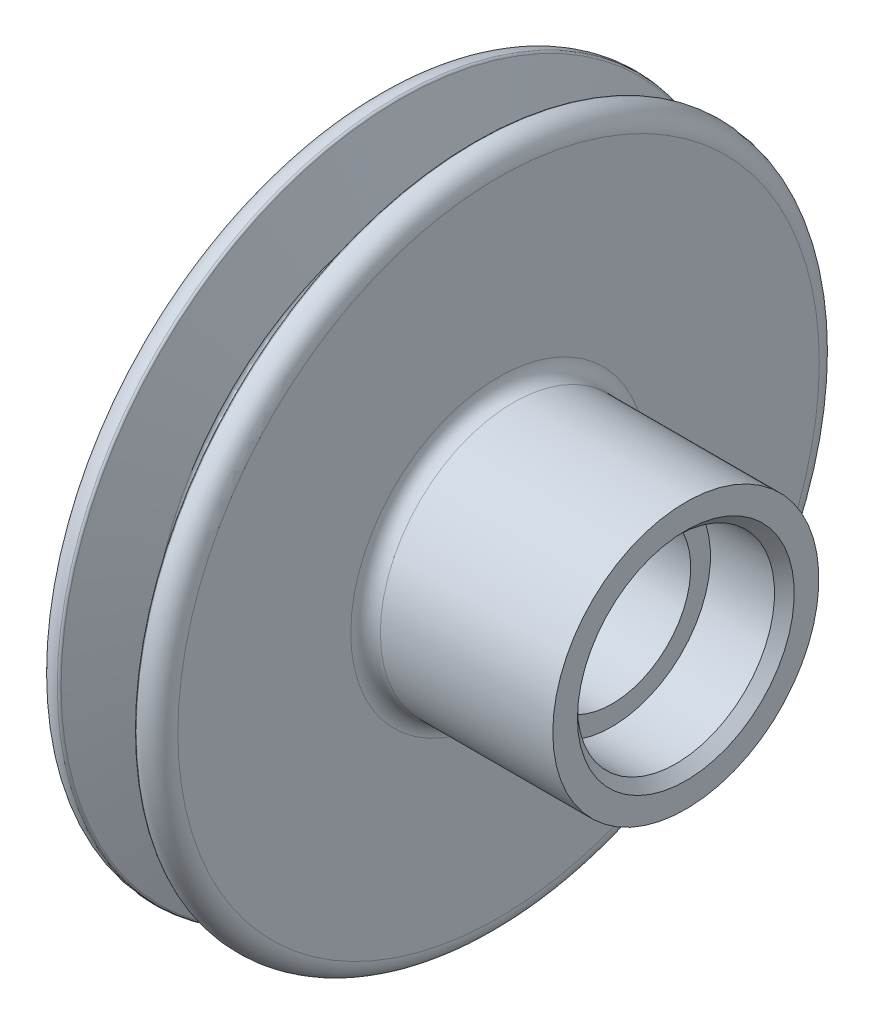
ISO-10303-21;
HEADER;
FILE_DESCRIPTION(('STEP AP214'),'2;1');
FILE_NAME('part.step','',(''),(''),'','','');
FILE_SCHEMA(('AUTOMOTIVE_DESIGN { 1 0 10303 214 1 1 1 1 }'));
ENDSEC;
DATA;
#1=APPLICATION_CONTEXT('core data for automotive mechanical design processes');
#2=APPLICATION_PROTOCOL_DEFINITION('international standard','automotive_design',2000,#1);
#3=PRODUCT_CONTEXT('',#1,'mechanical');
#4=PRODUCT('Part','Part','',(#3));
#5=PRODUCT_RELATED_PRODUCT_CATEGORY('part','',(#4));
#6=PRODUCT_DEFINITION_FORMATION('','',#4);
#7=PRODUCT_DEFINITION_CONTEXT('part definition',#1,'design');
#8=PRODUCT_DEFINITION('design','',#6,#7);
#9=PRODUCT_DEFINITION_SHAPE('','',#8);
#10=(LENGTH_UNIT() NAMED_UNIT(*) SI_UNIT(.MILLI.,.METRE.));
#11=(NAMED_UNIT(*) PLANE_ANGLE_UNIT() SI_UNIT($,.RADIAN.));
#12=(NAMED_UNIT(*) SI_UNIT($,.STERADIAN.) SOLID_ANGLE_UNIT());
#13=UNCERTAINTY_MEASURE_WITH_UNIT(LENGTH_MEASURE(1.E-05),#10,'distance_accuracy_value','');
#14=(GEOMETRIC_REPRESENTATION_CONTEXT(3) GLOBAL_UNCERTAINTY_ASSIGNED_CONTEXT((#13)) GLOBAL_UNIT_ASSIGNED_CONTEXT((#10,
#11,#12)) REPRESENTATION_CONTEXT('',''));
#15=CARTESIAN_POINT('',(0.,0.,0.));
#16=DIRECTION('',(0.,0.,1.));
#17=DIRECTION('',(1.,0.,0.));
#18=AXIS2_PLACEMENT_3D('',#15,#16,#17);
#19=CARTESIAN_POINT('',(4.,0.,0.));
#20=DIRECTION('',(-1.,0.,0.));
#21=DIRECTION('',(0.,0.,1.));
#22=AXIS2_PLACEMENT_3D('',#19,#20,#21);
#23=TOROIDAL_SURFACE('',#22,65.0846343159085,4.);
#24=CARTESIAN_POINT('',(4.49229780879908,0.,0.));
#25=DIRECTION('',(-1.,0.,0.));
#26=DIRECTION('',(0.,0.,1.));
#27=AXIS2_PLACEMENT_3D('',#24,#25,#26);
#28=CIRCLE('',#27,69.0542240765078);
#29=CARTESIAN_POINT('',(4.49229780879908,0.,69.0542240765078));
#30=VERTEX_POINT('',#29);
#31=EDGE_CURVE('E79',#30,#30,#28,.T.);
#32=ORIENTED_EDGE('',*,*,#31,.T.);
#33=EDGE_LOOP('',(#32));
#34=FACE_BOUND('',#33,.T.);
#35=CARTESIAN_POINT('',(0.,0.,0.));
#36=DIRECTION('',(-1.,0.,0.));
#37=DIRECTION('',(0.,0.,1.));
#38=AXIS2_PLACEMENT_3D('',#35,#36,#37);
#39=CIRCLE('',#38,65.0846343159085);
#40=CARTESIAN_POINT('',(0.,0.,65.0846343159085));
#41=VERTEX_POINT('',#40);
#42=EDGE_CURVE('E118',#41,#41,#39,.T.);
#43=ORIENTED_EDGE('',*,*,#42,.F.);
#44=EDGE_LOOP('',(#43));
#45=FACE_BOUND('',#44,.T.);
#46=ADVANCED_FACE('F37',(#34,#45),#23,.T.);
#47=CARTESIAN_POINT('',(9.40444147385724,0.,0.));
#48=DIRECTION('',(-1.,0.,0.));
#49=DIRECTION('',(0.,0.,1.));
#50=AXIS2_PLACEMENT_3D('',#47,#48,#49);
#51=CONICAL_SURFACE('',#50,54.,1.27409035395586);
#52=CARTESIAN_POINT('',(9.18809779292271,0.,0.));
#53=DIRECTION('',(-1.,0.,0.));
#54=DIRECTION('',(0.,0.,1.));
#55=AXIS2_PLACEMENT_3D('',#52,#53,#54);
#56=CIRCLE('',#55,54.7076282952773);
#57=CARTESIAN_POINT('',(9.18809779292271,0.,54.7076282952773));
#58=VERTEX_POINT('',#57);
#59=EDGE_CURVE('E64',#58,#58,#56,.T.);
#60=ORIENTED_EDGE('',*,*,#59,.T.);
#61=EDGE_LOOP('',(#60));
#62=FACE_BOUND('',#61,.T.);
#63=CARTESIAN_POINT('',(4.90891296068067,0.,0.));
#64=DIRECTION('',(1.,0.,0.));
#65=DIRECTION('',(0.,0.,-1.));
#66=AXIS2_PLACEMENT_3D('',#63,#64,#65);
#67=CIRCLE('',#66,68.7042112087939);
#68=CARTESIAN_POINT('',(4.90891296068067,0.,-68.7042112087939));
#69=VERTEX_POINT('',#68);
#70=EDGE_CURVE('E76',#69,#69,#67,.T.);
#71=ORIENTED_EDGE('',*,*,#70,.T.);
#72=EDGE_LOOP('',(#71));
#73=FACE_BOUND('',#72,.T.);
#74=ADVANCED_FACE('F125',(#62,#73),#51,.T.);
#75=CARTESIAN_POINT('',(-22.8662381660023,0.,0.));
#76=DIRECTION('',(-1.,0.,0.));
#77=DIRECTION('',(0.,0.,1.));
#78=AXIS2_PLACEMENT_3D('',#75,#76,#77);
#79=CYLINDRICAL_SURFACE('',#78,54.);
#80=CARTESIAN_POINT('',(14.8555974511143,0.,0.));
#81=DIRECTION('',(-1.,0.,0.));
#82=DIRECTION('',(0.,0.,1.));
#83=AXIS2_PLACEMENT_3D('',#80,#81,#82);
#84=CIRCLE('',#83,54.);
#85=CARTESIAN_POINT('',(14.8555974511143,0.,54.));
#86=VERTEX_POINT('',#85);
#87=EDGE_CURVE('E70',#86,#86,#84,.T.);
#88=ORIENTED_EDGE('',*,*,#87,.T.);
#89=EDGE_LOOP('',(#88));
#90=FACE_BOUND('',#89,.T.);
#91=CARTESIAN_POINT('',(10.1444025488857,0.,0.));
#92=DIRECTION('',(-1.,0.,0.));
#93=DIRECTION('',(0.,0.,1.));
#94=AXIS2_PLACEMENT_3D('',#91,#92,#93);
#95=CIRCLE('',#94,54.);
#96=CARTESIAN_POINT('',(10.1444025488857,0.,54.));
#97=VERTEX_POINT('',#96);
#98=EDGE_CURVE('E73',#97,#97,#95,.F.);
#99=ORIENTED_EDGE('',*,*,#98,.T.);
#100=EDGE_LOOP('',(#99));
#101=FACE_BOUND('',#100,.T.);
#102=ADVANCED_FACE('F131',(#90,#101),#79,.T.);
#103=CARTESIAN_POINT('',(20.1815187480226,0.,0.));
#104=DIRECTION('',(1.,0.,0.));
#105=DIRECTION('',(0.,0.,-1.));
#106=AXIS2_PLACEMENT_3D('',#103,#104,#105);
#107=CONICAL_SURFACE('',#106,69.,1.27409035395586);
#108=CARTESIAN_POINT('',(15.8119022070773,0.,0.));
#109=DIRECTION('',(1.,0.,0.));
#110=DIRECTION('',(0.,0.,-1.));
#111=AXIS2_PLACEMENT_3D('',#108,#109,#110);
#112=CIRCLE('',#111,54.7076282952773);
#113=CARTESIAN_POINT('',(15.8119022070773,0.,-54.7076282952773));
#114=VERTEX_POINT('',#113);
#115=EDGE_CURVE('E67',#114,#114,#112,.T.);
#116=ORIENTED_EDGE('',*,*,#115,.T.);
#117=EDGE_LOOP('',(#116));
#118=FACE_BOUND('',#117,.T.);
#119=CARTESIAN_POINT('',(20.0910870393193,0.,0.));
#120=DIRECTION('',(-1.,0.,0.));
#121=DIRECTION('',(0.,0.,1.));
#122=AXIS2_PLACEMENT_3D('',#119,#120,#121);
#123=CIRCLE('',#122,68.7042112087939);
#124=CARTESIAN_POINT('',(20.0910870393193,0.,68.7042112087939));
#125=VERTEX_POINT('',#124);
#126=EDGE_CURVE('E85',#125,#125,#123,.T.);
#127=ORIENTED_EDGE('',*,*,#126,.T.);
#128=EDGE_LOOP('',(#127));
#129=FACE_BOUND('',#128,.T.);
#130=ADVANCED_FACE('F210',(#118,#129),#107,.T.);
#131=CARTESIAN_POINT('',(21.,0.,0.));
#132=DIRECTION('',(-1.,0.,0.));
#133=DIRECTION('',(0.,0.,1.));
#134=AXIS2_PLACEMENT_3D('',#131,#132,#133);
#135=TOROIDAL_SURFACE('',#134,65.0846343159085,3.99999999999999);
#136=CARTESIAN_POINT('',(20.5077021912009,0.,0.));
#137=DIRECTION('',(1.,0.,0.));
#138=DIRECTION('',(0.,0.,-1.));
#139=AXIS2_PLACEMENT_3D('',#136,#137,#138);
#140=CIRCLE('',#139,69.0542240765078);
#141=CARTESIAN_POINT('',(20.5077021912009,0.,-69.0542240765078));
#142=VERTEX_POINT('',#141);
#143=EDGE_CURVE('E82',#142,#142,#140,.T.);
#144=ORIENTED_EDGE('',*,*,#143,.T.);
#145=EDGE_LOOP('',(#144));
#146=FACE_BOUND('',#145,.T.);
#147=CARTESIAN_POINT('',(25.,0.,0.));
#148=DIRECTION('',(-1.,0.,0.));
#149=DIRECTION('',(0.,0.,1.));
#150=AXIS2_PLACEMENT_3D('',#147,#148,#149);
#151=CIRCLE('',#150,65.0846343159085);
#152=CARTESIAN_POINT('',(25.,0.,65.0846343159085));
#153=VERTEX_POINT('',#152);
#154=EDGE_CURVE('E88',#153,#153,#151,.T.);
#155=ORIENTED_EDGE('',*,*,#154,.T.);
#156=EDGE_LOOP('',(#155));
#157=FACE_BOUND('',#156,.T.);
#158=ADVANCED_FACE('F206',(#146,#157),#135,.T.);
#159=CARTESIAN_POINT('',(25.,65.0846343159085,0.));
#160=DIRECTION('',(-1.,0.,0.));
#161=DIRECTION('',(0.,0.,1.));
#162=AXIS2_PLACEMENT_3D('',#159,#160,#161);
#163=PLANE('',#162);
#164=CARTESIAN_POINT('',(25.,0.,0.));
#165=DIRECTION('',(-1.,0.,0.));
#166=DIRECTION('',(0.,0.,1.));
#167=AXIS2_PLACEMENT_3D('',#164,#165,#166);
#168=CIRCLE('',#167,30.);
#169=CARTESIAN_POINT('',(25.,0.,30.));
#170=VERTEX_POINT('',#169);
#171=EDGE_CURVE('E61',#170,#170,#168,.T.);
#172=ORIENTED_EDGE('',*,*,#171,.T.);
#173=EDGE_LOOP('',(#172));
#174=FACE_BOUND('',#173,.T.);
#175=ORIENTED_EDGE('',*,*,#154,.F.);
#176=EDGE_LOOP('',(#175));
#177=FACE_BOUND('',#176,.T.);
#178=ADVANCED_FACE('F202',(#174,#177),#163,.F.);
#179=CARTESIAN_POINT('',(-22.8662381660023,0.,0.));
#180=DIRECTION('',(-1.,0.,0.));
#181=DIRECTION('',(0.,0.,1.));
#182=AXIS2_PLACEMENT_3D('',#179,#180,#181);
#183=CYLINDRICAL_SURFACE('',#182,27.);
#184=CARTESIAN_POINT('',(28.,0.,0.));
#185=DIRECTION('',(-1.,0.,0.));
#186=DIRECTION('',(0.,0.,1.));
#187=AXIS2_PLACEMENT_3D('',#184,#185,#186);
#188=CIRCLE('',#187,27.);
#189=CARTESIAN_POINT('',(28.,0.,27.));
#190=VERTEX_POINT('',#189);
#191=EDGE_CURVE('E58',#190,#190,#188,.F.);
#192=ORIENTED_EDGE('',*,*,#191,.T.);
#193=EDGE_LOOP('',(#192));
#194=FACE_BOUND('',#193,.T.);
#195=CARTESIAN_POINT('',(63.,0.,0.));
#196=DIRECTION('',(-1.,0.,0.));
#197=DIRECTION('',(0.,0.,1.));
#198=AXIS2_PLACEMENT_3D('',#195,#196,#197);
#199=CIRCLE('',#198,27.);
#200=CARTESIAN_POINT('',(63.,0.,27.));
#201=VERTEX_POINT('',#200);
#202=EDGE_CURVE('E91',#201,#201,#199,.T.);
#203=ORIENTED_EDGE('',*,*,#202,.T.);
#204=EDGE_LOOP('',(#203));
#205=FACE_BOUND('',#204,.T.);
#206=ADVANCED_FACE('F199',(#194,#205),#183,.T.);
#207=CARTESIAN_POINT('',(63.,27.,0.));
#208=DIRECTION('',(-1.,0.,0.));
#209=DIRECTION('',(0.,0.,1.));
#210=AXIS2_PLACEMENT_3D('',#207,#208,#209);
#211=PLANE('',#210);
#212=CARTESIAN_POINT('',(63.,0.,0.));
#213=DIRECTION('',(-1.,0.,0.));
#214=DIRECTION('',(0.,0.,1.));
#215=AXIS2_PLACEMENT_3D('',#212,#213,#214);
#216=CIRCLE('',#215,22.);
#217=CARTESIAN_POINT('',(63.,0.,22.));
#218=VERTEX_POINT('',#217);
#219=EDGE_CURVE('E45',#218,#218,#216,.T.);
#220=ORIENTED_EDGE('',*,*,#219,.T.);
#221=EDGE_LOOP('',(#220));
#222=FACE_BOUND('',#221,.T.);
#223=ORIENTED_EDGE('',*,*,#202,.F.);
#224=EDGE_LOOP('',(#223));
#225=FACE_BOUND('',#224,.T.);
#226=ADVANCED_FACE('F196',(#222,#225),#211,.F.);
#227=CARTESIAN_POINT('',(-22.8662381660023,0.,0.));
#228=DIRECTION('',(-1.,0.,0.));
#229=DIRECTION('',(0.,0.,1.));
#230=AXIS2_PLACEMENT_3D('',#227,#228,#229);
#231=CYLINDRICAL_SURFACE('',#230,20.);
#232=CARTESIAN_POINT('',(61.,0.,0.));
#233=DIRECTION('',(-1.,0.,0.));
#234=DIRECTION('',(0.,0.,1.));
#235=AXIS2_PLACEMENT_3D('',#232,#233,#234);
#236=CIRCLE('',#235,20.);
#237=CARTESIAN_POINT('',(61.,0.,20.));
#238=VERTEX_POINT('',#237);
#239=EDGE_CURVE('E10',#238,#238,#236,.F.);
#240=ORIENTED_EDGE('',*,*,#239,.T.);
#241=EDGE_LOOP('',(#240));
#242=FACE_BOUND('',#241,.T.);
#243=CARTESIAN_POINT('',(48.,0.,0.));
#244=DIRECTION('',(-1.,0.,0.));
#245=DIRECTION('',(0.,0.,1.));
#246=AXIS2_PLACEMENT_3D('',#243,#244,#245);
#247=CIRCLE('',#246,20.);
#248=CARTESIAN_POINT('',(48.,0.,20.));
#249=VERTEX_POINT('',#248);
#250=EDGE_CURVE('E94',#249,#249,#247,.T.);
#251=ORIENTED_EDGE('',*,*,#250,.T.);
#252=EDGE_LOOP('',(#251));
#253=FACE_BOUND('',#252,.T.);
#254=ADVANCED_FACE('F192',(#242,#253),#231,.F.);
#255=CARTESIAN_POINT('',(48.,20.,0.));
#256=DIRECTION('',(-1.,0.,0.));
#257=DIRECTION('',(0.,0.,1.));
#258=AXIS2_PLACEMENT_3D('',#255,#256,#257);
#259=PLANE('',#258);
#260=ORIENTED_EDGE('',*,*,#250,.F.);
#261=EDGE_LOOP('',(#260));
#262=FACE_BOUND('',#261,.T.);
#263=CARTESIAN_POINT('',(48.,0.,0.));
#264=DIRECTION('',(-1.,0.,0.));
#265=DIRECTION('',(0.,0.,1.));
#266=AXIS2_PLACEMENT_3D('',#263,#264,#265);
#267=CIRCLE('',#266,16.);
#268=CARTESIAN_POINT('',(48.,0.,16.));
#269=VERTEX_POINT('',#268);
#270=EDGE_CURVE('E97',#269,#269,#267,.T.);
#271=ORIENTED_EDGE('',*,*,#270,.T.);
#272=EDGE_LOOP('',(#271));
#273=FACE_BOUND('',#272,.T.);
#274=ADVANCED_FACE('F184',(#262,#273),#259,.F.);
#275=CARTESIAN_POINT('',(-22.8662381660023,0.,0.));
#276=DIRECTION('',(-1.,0.,0.));
#277=DIRECTION('',(0.,0.,1.));
#278=AXIS2_PLACEMENT_3D('',#275,#276,#277);
#279=CYLINDRICAL_SURFACE('',#278,16.);
#280=ORIENTED_EDGE('',*,*,#270,.F.);
#281=EDGE_LOOP('',(#280));
#282=FACE_BOUND('',#281,.T.);
#283=CARTESIAN_POINT('',(18.,0.,0.));
#284=DIRECTION('',(-1.,0.,0.));
#285=DIRECTION('',(0.,0.,1.));
#286=AXIS2_PLACEMENT_3D('',#283,#284,#285);
#287=CIRCLE('',#286,16.);
#288=CARTESIAN_POINT('',(18.,0.,16.));
#289=VERTEX_POINT('',#288);
#290=EDGE_CURVE('E100',#289,#289,#287,.T.);
#291=ORIENTED_EDGE('',*,*,#290,.T.);
#292=EDGE_LOOP('',(#291));
#293=FACE_BOUND('',#292,.T.);
#294=ADVANCED_FACE('F178',(#282,#293),#279,.F.);
#295=CARTESIAN_POINT('',(18.,16.,0.));
#296=DIRECTION('',(1.,0.,0.));
#297=DIRECTION('',(0.,0.,-1.));
#298=AXIS2_PLACEMENT_3D('',#295,#296,#297);
#299=PLANE('',#298);
#300=ORIENTED_EDGE('',*,*,#290,.F.);
#301=EDGE_LOOP('',(#300));
#302=FACE_BOUND('',#301,.T.);
#303=CARTESIAN_POINT('',(18.,0.,0.));
#304=DIRECTION('',(-1.,0.,0.));
#305=DIRECTION('',(0.,0.,1.));
#306=AXIS2_PLACEMENT_3D('',#303,#304,#305);
#307=CIRCLE('',#306,20.);
#308=CARTESIAN_POINT('',(18.,0.,20.));
#309=VERTEX_POINT('',#308);
#310=EDGE_CURVE('E103',#309,#309,#307,.T.);
#311=ORIENTED_EDGE('',*,*,#310,.T.);
#312=EDGE_LOOP('',(#311));
#313=FACE_BOUND('',#312,.T.);
#314=ADVANCED_FACE('F173',(#302,#313),#299,.F.);
#315=CARTESIAN_POINT('',(-22.8662381660023,0.,0.));
#316=DIRECTION('',(-1.,0.,0.));
#317=DIRECTION('',(0.,0.,1.));
#318=AXIS2_PLACEMENT_3D('',#315,#316,#317);
#319=CYLINDRICAL_SURFACE('',#318,20.);
#320=CARTESIAN_POINT('',(2.00000000000001,0.,0.));
#321=DIRECTION('',(1.,0.,0.));
#322=DIRECTION('',(0.,0.,-1.));
#323=AXIS2_PLACEMENT_3D('',#320,#321,#322);
#324=CIRCLE('',#323,20.);
#325=CARTESIAN_POINT('',(2.00000000000001,0.,-20.));
#326=VERTEX_POINT('',#325);
#327=EDGE_CURVE('E53',#326,#326,#324,.F.);
#328=ORIENTED_EDGE('',*,*,#327,.T.);
#329=EDGE_LOOP('',(#328));
#330=FACE_BOUND('',#329,.T.);
#331=ORIENTED_EDGE('',*,*,#310,.F.);
#332=EDGE_LOOP('',(#331));
#333=FACE_BOUND('',#332,.T.);
#334=ADVANCED_FACE('F169',(#330,#333),#319,.F.);
#335=CARTESIAN_POINT('',(0.,20.,0.));
#336=DIRECTION('',(1.,0.,0.));
#337=DIRECTION('',(0.,0.,-1.));
#338=AXIS2_PLACEMENT_3D('',#335,#336,#337);
#339=PLANE('',#338);
#340=CARTESIAN_POINT('',(0.,0.,0.));
#341=DIRECTION('',(1.,0.,0.));
#342=DIRECTION('',(0.,0.,-1.));
#343=AXIS2_PLACEMENT_3D('',#340,#341,#342);
#344=CIRCLE('',#343,22.);
#345=CARTESIAN_POINT('',(0.,0.,-22.));
#346=VERTEX_POINT('',#345);
#347=EDGE_CURVE('E49',#346,#346,#344,.T.);
#348=ORIENTED_EDGE('',*,*,#347,.T.);
#349=EDGE_LOOP('',(#348));
#350=FACE_BOUND('',#349,.T.);
#351=CARTESIAN_POINT('',(0.,0.,0.));
#352=DIRECTION('',(-1.,0.,0.));
#353=DIRECTION('',(0.,0.,1.));
#354=AXIS2_PLACEMENT_3D('',#351,#352,#353);
#355=CIRCLE('',#354,31.);
#356=CARTESIAN_POINT('',(0.,0.,31.));
#357=VERTEX_POINT('',#356);
#358=EDGE_CURVE('E106',#357,#357,#355,.T.);
#359=ORIENTED_EDGE('',*,*,#358,.T.);
#360=EDGE_LOOP('',(#359));
#361=FACE_BOUND('',#360,.T.);
#362=ADVANCED_FACE('F172',(#350,#361),#339,.F.);
#363=CARTESIAN_POINT('',(-22.8662381660023,0.,0.));
#364=DIRECTION('',(-1.,0.,0.));
#365=DIRECTION('',(0.,0.,1.));
#366=AXIS2_PLACEMENT_3D('',#363,#364,#365);
#367=CYLINDRICAL_SURFACE('',#366,31.);
#368=ORIENTED_EDGE('',*,*,#358,.F.);
#369=EDGE_LOOP('',(#368));
#370=FACE_BOUND('',#369,.T.);
#371=CARTESIAN_POINT('',(8.,0.,0.));
#372=DIRECTION('',(-1.,0.,0.));
#373=DIRECTION('',(0.,0.,1.));
#374=AXIS2_PLACEMENT_3D('',#371,#372,#373);
#375=CIRCLE('',#374,31.);
#376=CARTESIAN_POINT('',(8.,0.,31.));
#377=VERTEX_POINT('',#376);
#378=EDGE_CURVE('E109',#377,#377,#375,.T.);
#379=ORIENTED_EDGE('',*,*,#378,.T.);
#380=EDGE_LOOP('',(#379));
#381=FACE_BOUND('',#380,.T.);
#382=ADVANCED_FACE('F279',(#370,#381),#367,.T.);
#383=CARTESIAN_POINT('',(8.,0.,0.));
#384=DIRECTION('',(-1.,0.,0.));
#385=DIRECTION('',(0.,0.,1.));
#386=AXIS2_PLACEMENT_3D('',#383,#384,#385);
#387=TOROIDAL_SURFACE('',#386,34.,3.);
#388=ORIENTED_EDGE('',*,*,#378,.F.);
#389=EDGE_LOOP('',(#388));
#390=FACE_BOUND('',#389,.T.);
#391=CARTESIAN_POINT('',(8.,0.,0.));
#392=DIRECTION('',(-1.,0.,0.));
#393=DIRECTION('',(0.,0.,1.));
#394=AXIS2_PLACEMENT_3D('',#391,#392,#393);
#395=CIRCLE('',#394,37.);
#396=CARTESIAN_POINT('',(8.,0.,37.));
#397=VERTEX_POINT('',#396);
#398=EDGE_CURVE('E112',#397,#397,#395,.T.);
#399=ORIENTED_EDGE('',*,*,#398,.T.);
#400=EDGE_LOOP('',(#399));
#401=FACE_BOUND('',#400,.T.);
#402=ADVANCED_FACE('F284',(#390,#401),#387,.F.);
#403=CARTESIAN_POINT('',(-22.8662381660023,0.,0.));
#404=DIRECTION('',(-1.,0.,0.));
#405=DIRECTION('',(0.,0.,1.));
#406=AXIS2_PLACEMENT_3D('',#403,#404,#405);
#407=CYLINDRICAL_SURFACE('',#406,37.);
#408=ORIENTED_EDGE('',*,*,#398,.F.);
#409=EDGE_LOOP('',(#408));
#410=FACE_BOUND('',#409,.T.);
#411=CARTESIAN_POINT('',(0.,0.,0.));
#412=DIRECTION('',(-1.,0.,0.));
#413=DIRECTION('',(0.,0.,1.));
#414=AXIS2_PLACEMENT_3D('',#411,#412,#413);
#415=CIRCLE('',#414,37.);
#416=CARTESIAN_POINT('',(0.,0.,37.));
#417=VERTEX_POINT('',#416);
#418=EDGE_CURVE('E115',#417,#417,#415,.T.);
#419=ORIENTED_EDGE('',*,*,#418,.T.);
#420=EDGE_LOOP('',(#419));
#421=FACE_BOUND('',#420,.T.);
#422=ADVANCED_FACE('F297',(#410,#421),#407,.F.);
#423=CARTESIAN_POINT('',(0.,37.,0.));
#424=DIRECTION('',(1.,0.,0.));
#425=DIRECTION('',(0.,0.,-1.));
#426=AXIS2_PLACEMENT_3D('',#423,#424,#425);
#427=PLANE('',#426);
#428=ORIENTED_EDGE('',*,*,#418,.F.);
#429=EDGE_LOOP('',(#428));
#430=FACE_BOUND('',#429,.T.);
#431=ORIENTED_EDGE('',*,*,#42,.T.);
#432=EDGE_LOOP('',(#431));
#433=FACE_BOUND('',#432,.T.);
#434=ADVANCED_FACE('F122',(#430,#433),#427,.F.);
#435=CARTESIAN_POINT('',(20.5692394173009,0.,0.));
#436=DIRECTION('',(1.,0.,0.));
#437=DIRECTION('',(0.,0.,-1.));
#438=AXIS2_PLACEMENT_3D('',#435,#436,#437);
#439=TOROIDAL_SURFACE('',#438,68.5580253564325,0.5);
#440=ORIENTED_EDGE('',*,*,#143,.F.);
#441=EDGE_LOOP('',(#440));
#442=FACE_BOUND('',#441,.T.);
#443=ORIENTED_EDGE('',*,*,#126,.F.);
#444=EDGE_LOOP('',(#443));
#445=FACE_BOUND('',#444,.T.);
#446=ADVANCED_FACE('F136',(#442,#445),#439,.T.);
#447=CARTESIAN_POINT('',(4.43076058269915,0.,0.));
#448=DIRECTION('',(1.,0.,0.));
#449=DIRECTION('',(0.,0.,-1.));
#450=AXIS2_PLACEMENT_3D('',#447,#448,#449);
#451=TOROIDAL_SURFACE('',#450,68.5580253564325,0.5);
#452=ORIENTED_EDGE('',*,*,#70,.F.);
#453=EDGE_LOOP('',(#452));
#454=FACE_BOUND('',#453,.T.);
#455=ORIENTED_EDGE('',*,*,#31,.F.);
#456=EDGE_LOOP('',(#455));
#457=FACE_BOUND('',#456,.T.);
#458=ADVANCED_FACE('F139',(#454,#457),#451,.T.);
#459=CARTESIAN_POINT('',(14.8555974511143,0.,0.));
#460=DIRECTION('',(-1.,0.,0.));
#461=DIRECTION('',(0.,0.,1.));
#462=AXIS2_PLACEMENT_3D('',#459,#460,#461);
#463=TOROIDAL_SURFACE('',#462,55.,1.);
#464=ORIENTED_EDGE('',*,*,#115,.F.);
#465=EDGE_LOOP('',(#464));
#466=FACE_BOUND('',#465,.T.);
#467=ORIENTED_EDGE('',*,*,#87,.F.);
#468=EDGE_LOOP('',(#467));
#469=FACE_BOUND('',#468,.T.);
#470=ADVANCED_FACE('F143',(#466,#469),#463,.F.);
#471=CARTESIAN_POINT('',(10.1444025488857,0.,0.));
#472=DIRECTION('',(-1.,0.,0.));
#473=DIRECTION('',(0.,0.,1.));
#474=AXIS2_PLACEMENT_3D('',#471,#472,#473);
#475=TOROIDAL_SURFACE('',#474,55.,1.);
#476=ORIENTED_EDGE('',*,*,#98,.F.);
#477=EDGE_LOOP('',(#476));
#478=FACE_BOUND('',#477,.T.);
#479=ORIENTED_EDGE('',*,*,#59,.F.);
#480=EDGE_LOOP('',(#479));
#481=FACE_BOUND('',#480,.T.);
#482=ADVANCED_FACE('F147',(#478,#481),#475,.F.);
#483=CARTESIAN_POINT('',(28.,0.,0.));
#484=DIRECTION('',(-1.,0.,0.));
#485=DIRECTION('',(0.,0.,1.));
#486=AXIS2_PLACEMENT_3D('',#483,#484,#485);
#487=TOROIDAL_SURFACE('',#486,30.,3.);
#488=ORIENTED_EDGE('',*,*,#191,.F.);
#489=EDGE_LOOP('',(#488));
#490=FACE_BOUND('',#489,.T.);
#491=ORIENTED_EDGE('',*,*,#171,.F.);
#492=EDGE_LOOP('',(#491));
#493=FACE_BOUND('',#492,.T.);
#494=ADVANCED_FACE('F151',(#490,#493),#487,.F.);
#495=CARTESIAN_POINT('',(2.00000000000001,0.,0.));
#496=DIRECTION('',(-1.,0.,0.));
#497=DIRECTION('',(0.,0.,1.));
#498=AXIS2_PLACEMENT_3D('',#495,#496,#497);
#499=CONICAL_SURFACE('',#498,20.,0.785398163397451);
#500=ORIENTED_EDGE('',*,*,#347,.F.);
#501=EDGE_LOOP('',(#500));
#502=FACE_BOUND('',#501,.T.);
#503=ORIENTED_EDGE('',*,*,#327,.F.);
#504=EDGE_LOOP('',(#503));
#505=FACE_BOUND('',#504,.T.);
#506=ADVANCED_FACE('F154',(#502,#505),#499,.F.);
#507=CARTESIAN_POINT('',(63.,0.,0.));
#508=DIRECTION('',(1.,0.,0.));
#509=DIRECTION('',(0.,0.,-1.));
#510=AXIS2_PLACEMENT_3D('',#507,#508,#509);
#511=CONICAL_SURFACE('',#510,22.,0.785398163397447);
#512=ORIENTED_EDGE('',*,*,#239,.F.);
#513=EDGE_LOOP('',(#512));
#514=FACE_BOUND('',#513,.T.);
#515=ORIENTED_EDGE('',*,*,#219,.F.);
#516=EDGE_LOOP('',(#515));
#517=FACE_BOUND('',#516,.T.);
#518=ADVANCED_FACE('F40',(#514,#517),#511,.F.);
#519=CLOSED_SHELL('',(#46,#74,#102,#130,#158,#178,#206,#226,#254,#274,#294,#314,#334,#362,#382,
#402,#422,#434,#446,#458,#470,#482,#494,#506,#518));
#520=MANIFOLD_SOLID_BREP('B2',#519);
#521=ADVANCED_BREP_SHAPE_REPRESENTATION('',(#18,#520),#14);
#522=SHAPE_DEFINITION_REPRESENTATION(#9,#521);
ENDSEC;
END-ISO-10303-21;
